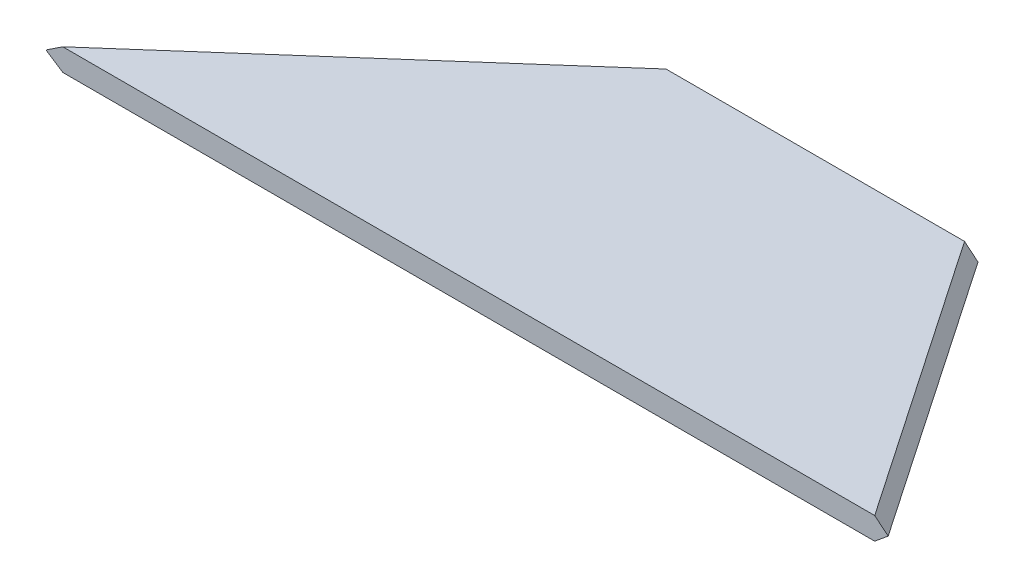
ISO-10303-21;
HEADER;
FILE_DESCRIPTION(('STEP AP214'),'2;1');
FILE_NAME('part.step','',(''),(''),'','','');
FILE_SCHEMA(('AUTOMOTIVE_DESIGN { 1 0 10303 214 1 1 1 1 }'));
ENDSEC;
DATA;
#1=APPLICATION_CONTEXT('core data for automotive mechanical design processes');
#2=APPLICATION_PROTOCOL_DEFINITION('international standard','automotive_design',2000,#1);
#3=PRODUCT_CONTEXT('',#1,'mechanical');
#4=PRODUCT('Part','Part','',(#3));
#5=PRODUCT_RELATED_PRODUCT_CATEGORY('part','',(#4));
#6=PRODUCT_DEFINITION_FORMATION('','',#4);
#7=PRODUCT_DEFINITION_CONTEXT('part definition',#1,'design');
#8=PRODUCT_DEFINITION('design','',#6,#7);
#9=PRODUCT_DEFINITION_SHAPE('','',#8);
#10=(LENGTH_UNIT() NAMED_UNIT(*) SI_UNIT(.MILLI.,.METRE.));
#11=(NAMED_UNIT(*) PLANE_ANGLE_UNIT() SI_UNIT($,.RADIAN.));
#12=(NAMED_UNIT(*) SI_UNIT($,.STERADIAN.) SOLID_ANGLE_UNIT());
#13=UNCERTAINTY_MEASURE_WITH_UNIT(LENGTH_MEASURE(1.E-05),#10,'distance_accuracy_value','');
#14=(GEOMETRIC_REPRESENTATION_CONTEXT(3) GLOBAL_UNCERTAINTY_ASSIGNED_CONTEXT((#13)) GLOBAL_UNIT_ASSIGNED_CONTEXT((#10,
#11,#12)) REPRESENTATION_CONTEXT('',''));
#15=CARTESIAN_POINT('',(0.,0.,0.));
#16=DIRECTION('',(0.,0.,1.));
#17=DIRECTION('',(1.,0.,0.));
#18=AXIS2_PLACEMENT_3D('',#15,#16,#17);
#19=CARTESIAN_POINT('',(0.,5.2832,0.));
#20=DIRECTION('',(0.,0.,-1.));
#21=DIRECTION('',(-1.,0.,0.));
#22=AXIS2_PLACEMENT_3D('',#19,#20,#21);
#23=PLANE('',#22);
#24=DIRECTION('',(1.,0.,0.));
#25=VECTOR('',#24,1.);
#26=CARTESIAN_POINT('',(0.,0.,0.));
#27=LINE('',#26,#25);
#28=CARTESIAN_POINT('',(5.76724057439738,0.,0.));
#29=VERTEX_POINT('',#28);
#30=CARTESIAN_POINT('',(198.5886783908,0.,0.));
#31=VERTEX_POINT('',#30);
#32=EDGE_CURVE('E120',#29,#31,#27,.T.);
#33=ORIENTED_EDGE('',*,*,#32,.T.);
#34=DIRECTION('',(0.770908609254231,0.636945771771591,0.));
#35=VECTOR('',#34,1.);
#36=CARTESIAN_POINT('',(203.2,3.81000000000001,0.));
#37=LINE('',#36,#35);
#38=CARTESIAN_POINT('',(201.785861373179,2.64160000000002,0.));
#39=VERTEX_POINT('',#38);
#40=EDGE_CURVE('E51',#31,#39,#37,.T.);
#41=ORIENTED_EDGE('',*,*,#40,.T.);
#42=DIRECTION('',(0.770908609254231,-0.636945771771591,0.));
#43=VECTOR('',#42,1.);
#44=CARTESIAN_POINT('',(161.134820353978,36.2286016036556,0.));
#45=LINE('',#44,#43);
#46=CARTESIAN_POINT('',(198.5886783908,5.2832,0.));
#47=VERTEX_POINT('',#46);
#48=EDGE_CURVE('E61',#39,#47,#45,.F.);
#49=ORIENTED_EDGE('',*,*,#48,.T.);
#50=DIRECTION('',(1.,0.,0.));
#51=VECTOR('',#50,1.);
#52=CARTESIAN_POINT('',(0.,5.2832,0.));
#53=LINE('',#52,#51);
#54=CARTESIAN_POINT('',(5.76724057439738,5.2832,0.));
#55=VERTEX_POINT('',#54);
#56=EDGE_CURVE('E107',#55,#47,#53,.T.);
#57=ORIENTED_EDGE('',*,*,#56,.F.);
#58=DIRECTION('',(0.834368471970392,0.551207087202073,0.));
#59=VECTOR('',#58,1.);
#60=CARTESIAN_POINT('',(3.50451279097091,3.78837890772128,0.));
#61=LINE('',#60,#59);
#62=CARTESIAN_POINT('',(1.76862044281517,2.64159999999998,0.));
#63=VERTEX_POINT('',#62);
#64=EDGE_CURVE('E93',#55,#63,#61,.F.);
#65=ORIENTED_EDGE('',*,*,#64,.T.);
#66=DIRECTION('',(0.834368471970393,-0.55120708720207,0.));
#67=VECTOR('',#66,1.);
#68=CARTESIAN_POINT('',(53.0482109227875,-31.2351279097089,0.));
#69=LINE('',#68,#67);
#70=EDGE_CURVE('E103',#63,#29,#69,.T.);
#71=ORIENTED_EDGE('',*,*,#70,.T.);
#72=EDGE_LOOP('',(#33,#41,#49,#57,#65,#71));
#73=FACE_BOUND('',#72,.T.);
#74=ADVANCED_FACE('F40',(#73),#23,.F.);
#75=CARTESIAN_POINT('',(157.48,5.2832,-67.056));
#76=DIRECTION('',(0.,0.,1.));
#77=DIRECTION('',(1.,0.,0.));
#78=AXIS2_PLACEMENT_3D('',#75,#76,#77);
#79=PLANE('',#78);
#80=DIRECTION('',(-0.770908609254231,0.636945771771591,0.));
#81=VECTOR('',#80,1.);
#82=CARTESIAN_POINT('',(142.586220186333,13.7788481198071,-67.056));
#83=LINE('',#82,#81);
#84=CARTESIAN_POINT('',(152.8686783908,5.2832,-67.056));
#85=VERTEX_POINT('',#84);
#86=CARTESIAN_POINT('',(156.065861373179,2.64160000000002,-67.056));
#87=VERTEX_POINT('',#86);
#88=EDGE_CURVE('E136',#85,#87,#83,.F.);
#89=ORIENTED_EDGE('',*,*,#88,.T.);
#90=DIRECTION('',(-0.770908609254231,-0.636945771771591,0.));
#91=VECTOR('',#90,1.);
#92=CARTESIAN_POINT('',(184.651399832355,26.2597534838485,-67.056));
#93=LINE('',#92,#91);
#94=CARTESIAN_POINT('',(152.8686783908,0.,-67.056));
#95=VERTEX_POINT('',#94);
#96=EDGE_CURVE('E141',#87,#95,#93,.T.);
#97=ORIENTED_EDGE('',*,*,#96,.T.);
#98=DIRECTION('',(-1.,0.,0.));
#99=VECTOR('',#98,1.);
#100=CARTESIAN_POINT('',(157.48,0.,-67.056));
#101=LINE('',#100,#99);
#102=CARTESIAN_POINT('',(81.9672405743974,0.,-67.056));
#103=VERTEX_POINT('',#102);
#104=EDGE_CURVE('E115',#95,#103,#101,.T.);
#105=ORIENTED_EDGE('',*,*,#104,.T.);
#106=DIRECTION('',(-0.834368471970393,0.55120708720207,0.));
#107=VECTOR('',#106,1.);
#108=CARTESIAN_POINT('',(76.2,3.80999999999998,-67.056));
#109=LINE('',#108,#107);
#110=CARTESIAN_POINT('',(77.9686204428152,2.6416,-67.056));
#111=VERTEX_POINT('',#110);
#112=EDGE_CURVE('E102',#103,#111,#109,.T.);
#113=ORIENTED_EDGE('',*,*,#112,.T.);
#114=DIRECTION('',(-0.834368471970392,-0.551207087202073,0.));
#115=VECTOR('',#114,1.);
#116=CARTESIAN_POINT('',(26.6563018681836,-31.2567490019877,-67.056));
#117=LINE('',#116,#115);
#118=CARTESIAN_POINT('',(81.9672405743974,5.2832,-67.056));
#119=VERTEX_POINT('',#118);
#120=EDGE_CURVE('E129',#111,#119,#117,.F.);
#121=ORIENTED_EDGE('',*,*,#120,.T.);
#122=DIRECTION('',(-1.,0.,0.));
#123=VECTOR('',#122,1.);
#124=CARTESIAN_POINT('',(157.48,5.2832,-67.056));
#125=LINE('',#124,#123);
#126=EDGE_CURVE('E110',#85,#119,#125,.T.);
#127=ORIENTED_EDGE('',*,*,#126,.F.);
#128=EDGE_LOOP('',(#89,#97,#105,#113,#121,#127));
#129=FACE_BOUND('',#128,.T.);
#130=ADVANCED_FACE('F163',(#129),#79,.F.);
#131=CARTESIAN_POINT('',(0.,5.2832,0.));
#132=DIRECTION('',(0.,-1.,0.));
#133=DIRECTION('',(0.,0.,-1.));
#134=AXIS2_PLACEMENT_3D('',#131,#132,#133);
#135=PLANE('',#134);
#136=ORIENTED_EDGE('',*,*,#56,.T.);
#137=DIRECTION('',(-0.56333682464151,0.,-0.826227342807548));
#138=VECTOR('',#137,1.);
#139=CARTESIAN_POINT('',(135.566883414877,5.2832,-92.4319659646885));
#140=LINE('',#139,#138);
#141=EDGE_CURVE('E11',#47,#85,#140,.T.);
#142=ORIENTED_EDGE('',*,*,#141,.T.);
#143=ORIENTED_EDGE('',*,*,#126,.T.);
#144=DIRECTION('',(-0.750713516922755,0.,0.660627894892025));
#145=VECTOR('',#144,1.);
#146=CARTESIAN_POINT('',(2.51699227953862,5.2832,2.86021849947571));
#147=LINE('',#146,#145);
#148=EDGE_CURVE('E97',#119,#55,#147,.T.);
#149=ORIENTED_EDGE('',*,*,#148,.T.);
#150=EDGE_LOOP('',(#136,#142,#143,#149));
#151=FACE_BOUND('',#150,.T.);
#152=ADVANCED_FACE('F106',(#151),#135,.F.);
#153=CARTESIAN_POINT('',(0.,0.,0.));
#154=DIRECTION('',(0.,-1.,0.));
#155=DIRECTION('',(0.,0.,-1.));
#156=AXIS2_PLACEMENT_3D('',#153,#154,#155);
#157=PLANE('',#156);
#158=ORIENTED_EDGE('',*,*,#104,.F.);
#159=DIRECTION('',(0.56333682464151,0.,0.826227342807548));
#160=VECTOR('',#159,1.);
#161=CARTESIAN_POINT('',(200.052073823903,0.,2.14631330188414));
#162=LINE('',#161,#160);
#163=EDGE_CURVE('E144',#95,#31,#162,.T.);
#164=ORIENTED_EDGE('',*,*,#163,.T.);
#165=ORIENTED_EDGE('',*,*,#32,.F.);
#166=DIRECTION('',(0.750713516922755,0.,-0.660627894892025));
#167=VECTOR('',#166,1.);
#168=CARTESIAN_POINT('',(78.7169922795386,0.,-64.1957815005243));
#169=LINE('',#168,#167);
#170=EDGE_CURVE('E132',#29,#103,#169,.T.);
#171=ORIENTED_EDGE('',*,*,#170,.T.);
#172=EDGE_LOOP('',(#158,#164,#165,#171));
#173=FACE_BOUND('',#172,.T.);
#174=ADVANCED_FACE('F155',(#173),#157,.T.);
#175=CARTESIAN_POINT('',(76.2,3.80999999999998,-67.056));
#176=DIRECTION('',(-0.467134464319142,-0.707106781186551,-0.530834618544479));
#177=DIRECTION('',(0.750713516922755,0.,-0.660627894892025));
#178=AXIS2_PLACEMENT_3D('',#175,#176,#177);
#179=PLANE('',#178);
#180=DIRECTION('',(0.750713516922755,0.,-0.660627894892025));
#181=VECTOR('',#180,1.);
#182=CARTESIAN_POINT('',(0.771877632391837,2.64159999999999,0.877133673172542));
#183=LINE('',#182,#181);
#184=EDGE_CURVE('E99',#111,#63,#183,.F.);
#185=ORIENTED_EDGE('',*,*,#184,.F.);
#186=ORIENTED_EDGE('',*,*,#112,.F.);
#187=ORIENTED_EDGE('',*,*,#170,.F.);
#188=ORIENTED_EDGE('',*,*,#70,.F.);
#189=EDGE_LOOP('',(#185,#186,#187,#188));
#190=FACE_BOUND('',#189,.T.);
#191=ADVANCED_FACE('F160',(#190),#179,.T.);
#192=CARTESIAN_POINT('',(2.51699227953862,5.2832,2.86021849947571));
#193=DIRECTION('',(0.467134464319144,-0.707106781186549,0.530834618544481));
#194=DIRECTION('',(-0.750713516922755,0.,0.660627894892025));
#195=AXIS2_PLACEMENT_3D('',#192,#193,#194);
#196=PLANE('',#195);
#197=ORIENTED_EDGE('',*,*,#120,.F.);
#198=ORIENTED_EDGE('',*,*,#184,.T.);
#199=ORIENTED_EDGE('',*,*,#64,.F.);
#200=ORIENTED_EDGE('',*,*,#148,.F.);
#201=EDGE_LOOP('',(#197,#198,#199,#200));
#202=FACE_BOUND('',#201,.T.);
#203=ADVANCED_FACE('F96',(#202),#196,.F.);
#204=CARTESIAN_POINT('',(135.566883414877,5.2832,-92.4319659646885));
#205=DIRECTION('',(-0.584230956900962,-0.707106781186544,0.39833928879611));
#206=DIRECTION('',(-0.56333682464151,0.,-0.826227342807548));
#207=AXIS2_PLACEMENT_3D('',#204,#205,#206);
#208=PLANE('',#207);
#209=ORIENTED_EDGE('',*,*,#141,.F.);
#210=ORIENTED_EDGE('',*,*,#48,.F.);
#211=DIRECTION('',(-0.56333682464151,0.,-0.826227342807548));
#212=VECTOR('',#211,1.);
#213=CARTESIAN_POINT('',(202.234635972664,2.64160000000002,0.658202745911127));
#214=LINE('',#213,#212);
#215=EDGE_CURVE('E45',#87,#39,#214,.F.);
#216=ORIENTED_EDGE('',*,*,#215,.F.);
#217=ORIENTED_EDGE('',*,*,#88,.F.);
#218=EDGE_LOOP('',(#209,#210,#216,#217));
#219=FACE_BOUND('',#218,.T.);
#220=ADVANCED_FACE('F43',(#219),#208,.F.);
#221=CARTESIAN_POINT('',(203.2,3.81000000000001,0.));
#222=DIRECTION('',(0.584230956900962,-0.707106781186544,-0.39833928879611));
#223=DIRECTION('',(0.56333682464151,0.,0.826227342807548));
#224=AXIS2_PLACEMENT_3D('',#221,#222,#223);
#225=PLANE('',#224);
#226=ORIENTED_EDGE('',*,*,#40,.F.);
#227=ORIENTED_EDGE('',*,*,#163,.F.);
#228=ORIENTED_EDGE('',*,*,#96,.F.);
#229=ORIENTED_EDGE('',*,*,#215,.T.);
#230=EDGE_LOOP('',(#226,#227,#228,#229));
#231=FACE_BOUND('',#230,.T.);
#232=ADVANCED_FACE('F167',(#231),#225,.T.);
#233=CLOSED_SHELL('',(#74,#130,#152,#174,#191,#203,#220,#232));
#234=MANIFOLD_SOLID_BREP('B2',#233);
#235=ADVANCED_BREP_SHAPE_REPRESENTATION('',(#18,#234),#14);
#236=SHAPE_DEFINITION_REPRESENTATION(#9,#235);
ENDSEC;
END-ISO-10303-21;
